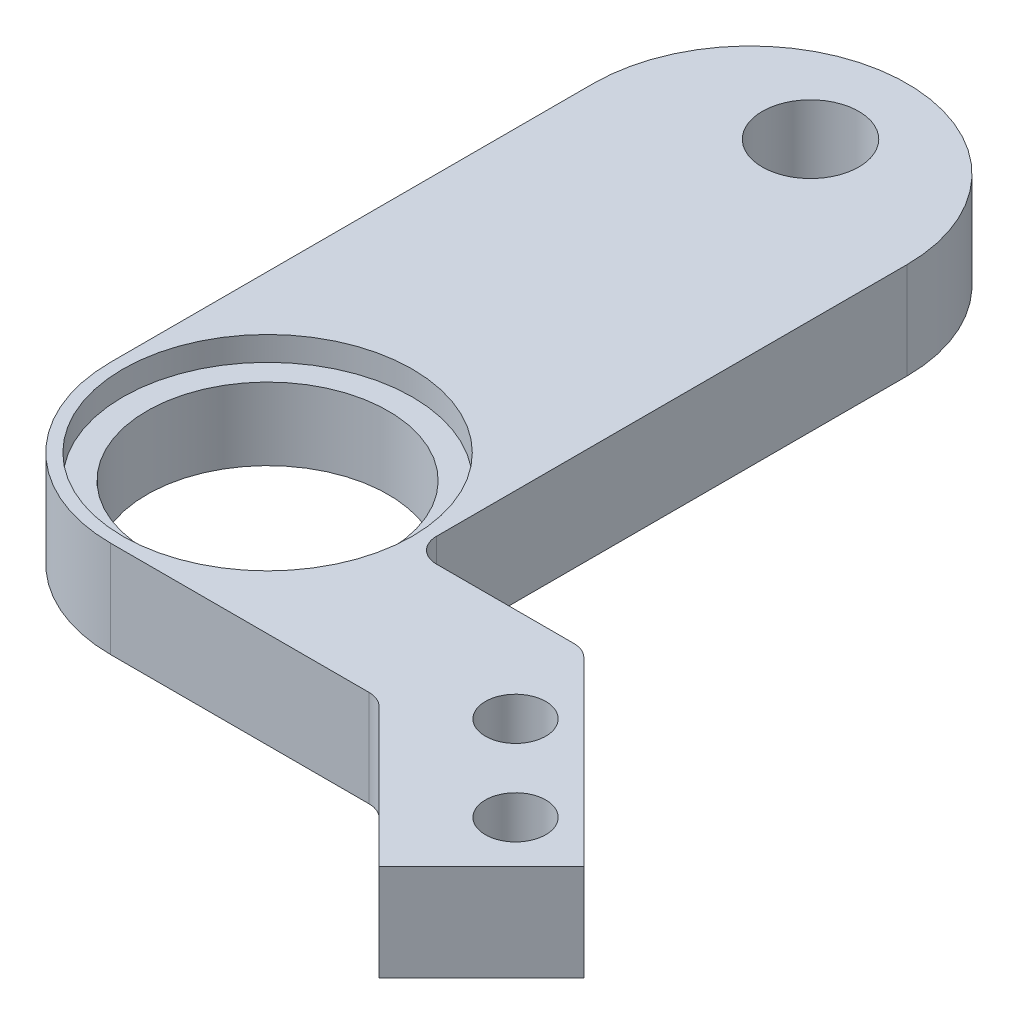
ISO-10303-21;
HEADER;
FILE_DESCRIPTION(('STEP AP214'),'2;1');
FILE_NAME('part.step','',(''),(''),'','','');
FILE_SCHEMA(('AUTOMOTIVE_DESIGN { 1 0 10303 214 1 1 1 1 }'));
ENDSEC;
DATA;
#1=APPLICATION_CONTEXT('core data for automotive mechanical design processes');
#2=APPLICATION_PROTOCOL_DEFINITION('international standard','automotive_design',2000,#1);
#3=PRODUCT_CONTEXT('',#1,'mechanical');
#4=PRODUCT('Part','Part','',(#3));
#5=PRODUCT_RELATED_PRODUCT_CATEGORY('part','',(#4));
#6=PRODUCT_DEFINITION_FORMATION('','',#4);
#7=PRODUCT_DEFINITION_CONTEXT('part definition',#1,'design');
#8=PRODUCT_DEFINITION('design','',#6,#7);
#9=PRODUCT_DEFINITION_SHAPE('','',#8);
#10=(LENGTH_UNIT() NAMED_UNIT(*) SI_UNIT(.MILLI.,.METRE.));
#11=(NAMED_UNIT(*) PLANE_ANGLE_UNIT() SI_UNIT($,.RADIAN.));
#12=(NAMED_UNIT(*) SI_UNIT($,.STERADIAN.) SOLID_ANGLE_UNIT());
#13=UNCERTAINTY_MEASURE_WITH_UNIT(LENGTH_MEASURE(1.E-05),#10,'distance_accuracy_value','');
#14=(GEOMETRIC_REPRESENTATION_CONTEXT(3) GLOBAL_UNCERTAINTY_ASSIGNED_CONTEXT((#13)) GLOBAL_UNIT_ASSIGNED_CONTEXT((#10,
#11,#12)) REPRESENTATION_CONTEXT('',''));
#15=CARTESIAN_POINT('',(0.,0.,0.));
#16=DIRECTION('',(0.,0.,1.));
#17=DIRECTION('',(1.,0.,0.));
#18=AXIS2_PLACEMENT_3D('',#15,#16,#17);
#19=CARTESIAN_POINT('',(2.53296168761796E-09,2.,0.));
#20=DIRECTION('',(0.,-1.,0.));
#21=DIRECTION('',(0.,0.,-1.));
#22=AXIS2_PLACEMENT_3D('',#19,#20,#21);
#23=PLANE('',#22);
#24=DIRECTION('',(0.,0.,-1.));
#25=VECTOR('',#24,1.);
#26=CARTESIAN_POINT('',(-6.5,2.,26.5));
#27=LINE('',#26,#25);
#28=CARTESIAN_POINT('',(-6.5,2.,20.));
#29=VERTEX_POINT('',#28);
#30=CARTESIAN_POINT('',(-6.5,2.,0.));
#31=VERTEX_POINT('',#30);
#32=EDGE_CURVE('E123',#29,#31,#27,.T.);
#33=ORIENTED_EDGE('',*,*,#32,.F.);
#34=CARTESIAN_POINT('',(0.,2.,20.));
#35=DIRECTION('',(0.,-1.,0.));
#36=DIRECTION('',(0.,0.,-1.));
#37=AXIS2_PLACEMENT_3D('',#34,#35,#36);
#38=CIRCLE('',#37,6.5);
#39=CARTESIAN_POINT('',(0.,2.,26.5));
#40=VERTEX_POINT('',#39);
#41=EDGE_CURVE('E11',#29,#40,#38,.F.);
#42=ORIENTED_EDGE('',*,*,#41,.T.);
#43=DIRECTION('',(-1.,0.,0.));
#44=VECTOR('',#43,1.);
#45=CARTESIAN_POINT('',(11.12,2.,26.5));
#46=LINE('',#45,#44);
#47=CARTESIAN_POINT('',(10.7057864376778,2.,26.5));
#48=VERTEX_POINT('',#47);
#49=EDGE_CURVE('E132',#48,#40,#46,.T.);
#50=ORIENTED_EDGE('',*,*,#49,.F.);
#51=CARTESIAN_POINT('',(10.7057864376778,2.,27.5));
#52=DIRECTION('',(0.,-1.,0.));
#53=DIRECTION('',(0.,0.,-1.));
#54=AXIS2_PLACEMENT_3D('',#51,#52,#53);
#55=CIRCLE('',#54,0.999999999999998);
#56=CARTESIAN_POINT('',(11.4128932188029,2.,26.792893218752));
#57=VERTEX_POINT('',#56);
#58=EDGE_CURVE('E213',#48,#57,#55,.T.);
#59=ORIENTED_EDGE('',*,*,#58,.T.);
#60=DIRECTION('',(-0.707106781248037,0.,-0.707106781125058));
#61=VECTOR('',#60,1.);
#62=CARTESIAN_POINT('',(-7.68999999970051,2.,7.69000000357092));
#63=LINE('',#62,#61);
#64=CARTESIAN_POINT('',(17.162942424051,2.,32.542942423));
#65=VERTEX_POINT('',#64);
#66=EDGE_CURVE('E172',#65,#57,#63,.T.);
#67=ORIENTED_EDGE('',*,*,#66,.F.);
#68=DIRECTION('',(-0.707106781186548,0.,0.707106781186547));
#69=VECTOR('',#68,1.);
#70=CARTESIAN_POINT('',(13.6052813740119,2.,36.100603473039));
#71=LINE('',#70,#69);
#72=CARTESIAN_POINT('',(21.405583111051,2.,28.300301736));
#73=VERTEX_POINT('',#72);
#74=EDGE_CURVE('E140',#73,#65,#71,.T.);
#75=ORIENTED_EDGE('',*,*,#74,.F.);
#76=DIRECTION('',(0.707106781233644,0.,0.707106781139451));
#77=VECTOR('',#76,1.);
#78=CARTESIAN_POINT('',(-3.44735931263372,2.,3.44735931562589));
#79=LINE('',#78,#77);
#80=CARTESIAN_POINT('',(13.8981745928173,2.,20.7928932187664));
#81=VERTEX_POINT('',#80);
#82=EDGE_CURVE('E153',#81,#73,#79,.T.);
#83=ORIENTED_EDGE('',*,*,#82,.F.);
#84=CARTESIAN_POINT('',(13.1910678116779,2.,21.5));
#85=DIRECTION('',(0.,-1.,0.));
#86=DIRECTION('',(0.,0.,-1.));
#87=AXIS2_PLACEMENT_3D('',#84,#85,#86);
#88=CIRCLE('',#87,0.999999999999998);
#89=CARTESIAN_POINT('',(13.1910678116779,2.,20.5));
#90=VERTEX_POINT('',#89);
#91=EDGE_CURVE('E205',#81,#90,#88,.F.);
#92=ORIENTED_EDGE('',*,*,#91,.T.);
#93=DIRECTION('',(1.,0.,0.));
#94=VECTOR('',#93,1.);
#95=CARTESIAN_POINT('',(6.50000000506592,2.,20.5));
#96=LINE('',#95,#94);
#97=CARTESIAN_POINT('',(7.50000000506592,2.,20.5));
#98=VERTEX_POINT('',#97);
#99=EDGE_CURVE('E147',#98,#90,#96,.T.);
#100=ORIENTED_EDGE('',*,*,#99,.F.);
#101=CARTESIAN_POINT('',(7.50000000506592,2.,19.5));
#102=DIRECTION('',(0.,-1.,0.));
#103=DIRECTION('',(0.,0.,-1.));
#104=AXIS2_PLACEMENT_3D('',#101,#102,#103);
#105=CIRCLE('',#104,0.999999999999998);
#106=CARTESIAN_POINT('',(6.50000000506592,2.,19.5));
#107=VERTEX_POINT('',#106);
#108=EDGE_CURVE('E209',#98,#107,#105,.T.);
#109=ORIENTED_EDGE('',*,*,#108,.T.);
#110=DIRECTION('',(0.,0.,1.));
#111=VECTOR('',#110,1.);
#112=CARTESIAN_POINT('',(6.50000000506592,2.,0.));
#113=LINE('',#112,#111);
#114=CARTESIAN_POINT('',(6.50000000506592,2.,0.));
#115=VERTEX_POINT('',#114);
#116=EDGE_CURVE('E145',#115,#107,#113,.T.);
#117=ORIENTED_EDGE('',*,*,#116,.F.);
#118=CARTESIAN_POINT('',(2.53296168761796E-09,2.,0.));
#119=DIRECTION('',(0.,-1.,0.));
#120=DIRECTION('',(0.,0.,-1.));
#121=AXIS2_PLACEMENT_3D('',#118,#119,#120);
#122=CIRCLE('',#121,6.50000000253296);
#123=EDGE_CURVE('E131',#31,#115,#122,.T.);
#124=ORIENTED_EDGE('',*,*,#123,.F.);
#125=EDGE_LOOP('',(#33,#42,#50,#59,#67,#75,#83,#92,#100,#109,#117,#124));
#126=FACE_BOUND('',#125,.T.);
#127=CARTESIAN_POINT('',(0.,2.,-2.5));
#128=DIRECTION('',(0.,1.,0.));
#129=DIRECTION('',(0.,0.,1.));
#130=AXIS2_PLACEMENT_3D('',#127,#128,#129);
#131=CIRCLE('',#130,2.);
#132=CARTESIAN_POINT('',(0.,2.,-0.5));
#133=VERTEX_POINT('',#132);
#134=EDGE_CURVE('E267',#133,#133,#131,.T.);
#135=ORIENTED_EDGE('',*,*,#134,.F.);
#136=EDGE_LOOP('',(#135));
#137=FACE_BOUND('',#136,.T.);
#138=CARTESIAN_POINT('',(18.2257623276237,2.,27.9489080793763));
#139=DIRECTION('',(0.,-1.,0.));
#140=DIRECTION('',(0.,0.,-1.));
#141=AXIS2_PLACEMENT_3D('',#138,#139,#140);
#142=CIRCLE('',#141,1.25);
#143=CARTESIAN_POINT('',(18.2257623276237,2.,26.6989080793763));
#144=VERTEX_POINT('',#143);
#145=EDGE_CURVE('E270',#144,#144,#142,.T.);
#146=ORIENTED_EDGE('',*,*,#145,.T.);
#147=EDGE_LOOP('',(#146));
#148=FACE_BOUND('',#147,.T.);
#149=CARTESIAN_POINT('',(14.6902284220255,2.,24.4133741729745));
#150=DIRECTION('',(0.,-1.,0.));
#151=DIRECTION('',(0.,0.,-1.));
#152=AXIS2_PLACEMENT_3D('',#149,#150,#151);
#153=CIRCLE('',#152,1.25);
#154=CARTESIAN_POINT('',(14.6902284220255,2.,23.1633741729745));
#155=VERTEX_POINT('',#154);
#156=EDGE_CURVE('E279',#155,#155,#153,.T.);
#157=ORIENTED_EDGE('',*,*,#156,.T.);
#158=EDGE_LOOP('',(#157));
#159=FACE_BOUND('',#158,.T.);
#160=CARTESIAN_POINT('',(0.,2.,20.));
#161=DIRECTION('',(0.,1.,0.));
#162=DIRECTION('',(0.,0.,1.));
#163=AXIS2_PLACEMENT_3D('',#160,#161,#162);
#164=CIRCLE('',#163,6.00000000000001);
#165=CARTESIAN_POINT('',(0.,2.,26.));
#166=VERTEX_POINT('',#165);
#167=EDGE_CURVE('E297',#166,#166,#164,.T.);
#168=ORIENTED_EDGE('',*,*,#167,.F.);
#169=EDGE_LOOP('',(#168));
#170=FACE_BOUND('',#169,.T.);
#171=ADVANCED_FACE('F32',(#126,#137,#148,#159,#170),#23,.F.);
#172=CARTESIAN_POINT('',(2.53296168761796E-09,-2.,0.));
#173=DIRECTION('',(0.,-1.,0.));
#174=DIRECTION('',(0.,0.,-1.));
#175=AXIS2_PLACEMENT_3D('',#172,#173,#174);
#176=PLANE('',#175);
#177=CARTESIAN_POINT('',(0.,-2.,20.));
#178=DIRECTION('',(0.,1.,0.));
#179=DIRECTION('',(0.,0.,1.));
#180=AXIS2_PLACEMENT_3D('',#177,#178,#179);
#181=CIRCLE('',#180,5.00000000000001);
#182=CARTESIAN_POINT('',(0.,-2.,25.));
#183=VERTEX_POINT('',#182);
#184=EDGE_CURVE('E288',#183,#183,#181,.T.);
#185=ORIENTED_EDGE('',*,*,#184,.T.);
#186=EDGE_LOOP('',(#185));
#187=FACE_BOUND('',#186,.T.);
#188=DIRECTION('',(-1.,0.,0.));
#189=VECTOR('',#188,1.);
#190=CARTESIAN_POINT('',(11.12,-2.,26.5));
#191=LINE('',#190,#189);
#192=CARTESIAN_POINT('',(10.7057864376778,-2.,26.5));
#193=VERTEX_POINT('',#192);
#194=CARTESIAN_POINT('',(0.,-2.,26.5));
#195=VERTEX_POINT('',#194);
#196=EDGE_CURVE('E156',#193,#195,#191,.T.);
#197=ORIENTED_EDGE('',*,*,#196,.T.);
#198=CARTESIAN_POINT('',(0.,-2.,20.));
#199=DIRECTION('',(0.,-1.,0.));
#200=DIRECTION('',(0.,0.,-1.));
#201=AXIS2_PLACEMENT_3D('',#198,#199,#200);
#202=CIRCLE('',#201,6.5);
#203=CARTESIAN_POINT('',(-6.5,-2.,20.));
#204=VERTEX_POINT('',#203);
#205=EDGE_CURVE('E54',#195,#204,#202,.T.);
#206=ORIENTED_EDGE('',*,*,#205,.T.);
#207=DIRECTION('',(0.,0.,-1.));
#208=VECTOR('',#207,1.);
#209=CARTESIAN_POINT('',(-6.5,-2.,26.5));
#210=LINE('',#209,#208);
#211=CARTESIAN_POINT('',(-6.5,-2.,0.));
#212=VERTEX_POINT('',#211);
#213=EDGE_CURVE('E158',#204,#212,#210,.T.);
#214=ORIENTED_EDGE('',*,*,#213,.T.);
#215=CARTESIAN_POINT('',(2.53296168761796E-09,-2.,0.));
#216=DIRECTION('',(0.,-1.,0.));
#217=DIRECTION('',(0.,0.,-1.));
#218=AXIS2_PLACEMENT_3D('',#215,#216,#217);
#219=CIRCLE('',#218,6.50000000253296);
#220=CARTESIAN_POINT('',(6.50000000506592,-2.,0.));
#221=VERTEX_POINT('',#220);
#222=EDGE_CURVE('E138',#212,#221,#219,.T.);
#223=ORIENTED_EDGE('',*,*,#222,.T.);
#224=DIRECTION('',(0.,0.,1.));
#225=VECTOR('',#224,1.);
#226=CARTESIAN_POINT('',(6.50000000506592,-2.,0.));
#227=LINE('',#226,#225);
#228=CARTESIAN_POINT('',(6.50000000506592,-2.,19.5));
#229=VERTEX_POINT('',#228);
#230=EDGE_CURVE('E162',#221,#229,#227,.T.);
#231=ORIENTED_EDGE('',*,*,#230,.T.);
#232=CARTESIAN_POINT('',(7.50000000506592,-2.,19.5));
#233=DIRECTION('',(0.,-1.,0.));
#234=DIRECTION('',(0.,0.,-1.));
#235=AXIS2_PLACEMENT_3D('',#232,#233,#234);
#236=CIRCLE('',#235,0.999999999999998);
#237=CARTESIAN_POINT('',(7.50000000506592,-2.,20.5));
#238=VERTEX_POINT('',#237);
#239=EDGE_CURVE('E207',#229,#238,#236,.F.);
#240=ORIENTED_EDGE('',*,*,#239,.T.);
#241=DIRECTION('',(1.,0.,0.));
#242=VECTOR('',#241,1.);
#243=CARTESIAN_POINT('',(6.50000000506592,-2.,20.5));
#244=LINE('',#243,#242);
#245=CARTESIAN_POINT('',(13.1910678116779,-2.,20.5));
#246=VERTEX_POINT('',#245);
#247=EDGE_CURVE('E165',#238,#246,#244,.T.);
#248=ORIENTED_EDGE('',*,*,#247,.T.);
#249=CARTESIAN_POINT('',(13.1910678116779,-2.,21.5));
#250=DIRECTION('',(0.,-1.,0.));
#251=DIRECTION('',(0.,0.,-1.));
#252=AXIS2_PLACEMENT_3D('',#249,#250,#251);
#253=CIRCLE('',#252,0.999999999999998);
#254=CARTESIAN_POINT('',(13.8981745928173,-2.,20.7928932187664));
#255=VERTEX_POINT('',#254);
#256=EDGE_CURVE('E201',#246,#255,#253,.T.);
#257=ORIENTED_EDGE('',*,*,#256,.T.);
#258=DIRECTION('',(0.707106781233644,0.,0.707106781139451));
#259=VECTOR('',#258,1.);
#260=CARTESIAN_POINT('',(-3.44735931263372,-2.,3.44735931562589));
#261=LINE('',#260,#259);
#262=CARTESIAN_POINT('',(16.1044419845782,-2.,22.9991606102334));
#263=VERTEX_POINT('',#262);
#264=EDGE_CURVE('E173',#255,#263,#261,.T.);
#265=ORIENTED_EDGE('',*,*,#264,.T.);
#266=CARTESIAN_POINT('',(14.6902284220255,-2.,24.4133741729745));
#267=DIRECTION('',(0.,-1.,0.));
#268=DIRECTION('',(0.,0.,-1.));
#269=AXIS2_PLACEMENT_3D('',#266,#267,#268);
#270=CIRCLE('',#269,2.);
#271=EDGE_CURVE('E285',#263,#263,#270,.T.);
#272=ORIENTED_EDGE('',*,*,#271,.F.);
#273=CARTESIAN_POINT('',(19.6399758908137,-2.,26.5346945159979));
#274=VERTEX_POINT('',#273);
#275=EDGE_CURVE('E177',#263,#274,#261,.T.);
#276=ORIENTED_EDGE('',*,*,#275,.T.);
#277=CARTESIAN_POINT('',(18.2257623276237,-2.,27.9489080793763));
#278=DIRECTION('',(0.,-1.,0.));
#279=DIRECTION('',(0.,0.,-1.));
#280=AXIS2_PLACEMENT_3D('',#277,#278,#279);
#281=CIRCLE('',#280,2.);
#282=EDGE_CURVE('E276',#274,#274,#281,.T.);
#283=ORIENTED_EDGE('',*,*,#282,.F.);
#284=CARTESIAN_POINT('',(21.405583111051,-2.,28.300301736));
#285=VERTEX_POINT('',#284);
#286=EDGE_CURVE('E168',#274,#285,#261,.T.);
#287=ORIENTED_EDGE('',*,*,#286,.T.);
#288=DIRECTION('',(-0.707106781186548,0.,0.707106781186547));
#289=VECTOR('',#288,1.);
#290=CARTESIAN_POINT('',(13.6052813740119,-2.,36.100603473039));
#291=LINE('',#290,#289);
#292=CARTESIAN_POINT('',(17.162942424051,-2.,32.542942423));
#293=VERTEX_POINT('',#292);
#294=EDGE_CURVE('E169',#285,#293,#291,.T.);
#295=ORIENTED_EDGE('',*,*,#294,.T.);
#296=DIRECTION('',(-0.707106781248037,0.,-0.707106781125058));
#297=VECTOR('',#296,1.);
#298=CARTESIAN_POINT('',(-7.68999999970051,-2.,7.69000000357092));
#299=LINE('',#298,#297);
#300=CARTESIAN_POINT('',(11.4128932188029,-2.,26.792893218752));
#301=VERTEX_POINT('',#300);
#302=EDGE_CURVE('E159',#293,#301,#299,.T.);
#303=ORIENTED_EDGE('',*,*,#302,.T.);
#304=CARTESIAN_POINT('',(10.7057864376778,-2.,27.5));
#305=DIRECTION('',(0.,-1.,0.));
#306=DIRECTION('',(0.,0.,-1.));
#307=AXIS2_PLACEMENT_3D('',#304,#305,#306);
#308=CIRCLE('',#307,0.999999999999998);
#309=EDGE_CURVE('E211',#301,#193,#308,.F.);
#310=ORIENTED_EDGE('',*,*,#309,.T.);
#311=EDGE_LOOP('',(#197,#206,#214,#223,#231,#240,#248,#257,#265,#272,#276,#283,#287,#295,#303,#310));
#312=FACE_BOUND('',#311,.T.);
#313=CARTESIAN_POINT('',(0.,-2.,-2.5));
#314=DIRECTION('',(0.,1.,0.));
#315=DIRECTION('',(0.,0.,1.));
#316=AXIS2_PLACEMENT_3D('',#313,#314,#315);
#317=CIRCLE('',#316,2.);
#318=CARTESIAN_POINT('',(0.,-2.,-0.500000000000001));
#319=VERTEX_POINT('',#318);
#320=EDGE_CURVE('E184',#319,#319,#317,.T.);
#321=ORIENTED_EDGE('',*,*,#320,.T.);
#322=EDGE_LOOP('',(#321));
#323=FACE_BOUND('',#322,.T.);
#324=ADVANCED_FACE('F226',(#187,#312,#323),#176,.T.);
#325=CARTESIAN_POINT('',(11.12,2.,26.5));
#326=DIRECTION('',(-0.707106781125058,0.,0.707106781248037));
#327=DIRECTION('',(0.707106781248037,0.,0.707106781125058));
#328=AXIS2_PLACEMENT_3D('',#325,#326,#327);
#329=PLANE('',#328);
#330=ORIENTED_EDGE('',*,*,#66,.T.);
#331=DIRECTION('',(0.,-1.,0.));
#332=VECTOR('',#331,1.);
#333=CARTESIAN_POINT('',(11.4128932188029,-2.,26.792893218752));
#334=LINE('',#333,#332);
#335=EDGE_CURVE('E196',#57,#301,#334,.T.);
#336=ORIENTED_EDGE('',*,*,#335,.T.);
#337=ORIENTED_EDGE('',*,*,#302,.F.);
#338=DIRECTION('',(0.,-1.,0.));
#339=VECTOR('',#338,1.);
#340=CARTESIAN_POINT('',(17.162942424051,2.,32.542942423));
#341=LINE('',#340,#339);
#342=EDGE_CURVE('E180',#65,#293,#341,.T.);
#343=ORIENTED_EDGE('',*,*,#342,.F.);
#344=EDGE_LOOP('',(#330,#336,#337,#343));
#345=FACE_BOUND('',#344,.T.);
#346=ADVANCED_FACE('F234',(#345),#329,.T.);
#347=CARTESIAN_POINT('',(13.6052813740119,2.,36.100603473039));
#348=DIRECTION('',(0.707106781186547,0.,0.707106781186548));
#349=DIRECTION('',(0.707106781186548,0.,-0.707106781186547));
#350=AXIS2_PLACEMENT_3D('',#347,#348,#349);
#351=PLANE('',#350);
#352=ORIENTED_EDGE('',*,*,#294,.F.);
#353=DIRECTION('',(0.,-1.,0.));
#354=VECTOR('',#353,1.);
#355=CARTESIAN_POINT('',(21.405583111051,2.,28.300301736));
#356=LINE('',#355,#354);
#357=EDGE_CURVE('E174',#73,#285,#356,.T.);
#358=ORIENTED_EDGE('',*,*,#357,.F.);
#359=ORIENTED_EDGE('',*,*,#74,.T.);
#360=ORIENTED_EDGE('',*,*,#342,.T.);
#361=EDGE_LOOP('',(#352,#358,#359,#360));
#362=FACE_BOUND('',#361,.T.);
#363=ADVANCED_FACE('F241',(#362),#351,.T.);
#364=CARTESIAN_POINT('',(13.6052813740119,2.,20.5));
#365=DIRECTION('',(0.707106781139451,0.,-0.707106781233644));
#366=DIRECTION('',(-0.707106781233644,0.,-0.707106781139451));
#367=AXIS2_PLACEMENT_3D('',#364,#365,#366);
#368=PLANE('',#367);
#369=ORIENTED_EDGE('',*,*,#264,.F.);
#370=DIRECTION('',(0.,-1.,0.));
#371=VECTOR('',#370,1.);
#372=CARTESIAN_POINT('',(13.8981745928173,2.,20.7928932187664));
#373=LINE('',#372,#371);
#374=EDGE_CURVE('E203',#255,#81,#373,.F.);
#375=ORIENTED_EDGE('',*,*,#374,.T.);
#376=ORIENTED_EDGE('',*,*,#82,.T.);
#377=ORIENTED_EDGE('',*,*,#357,.T.);
#378=ORIENTED_EDGE('',*,*,#286,.F.);
#379=ORIENTED_EDGE('',*,*,#275,.F.);
#380=EDGE_LOOP('',(#369,#375,#376,#377,#378,#379));
#381=FACE_BOUND('',#380,.T.);
#382=ADVANCED_FACE('F245',(#381),#368,.T.);
#383=CARTESIAN_POINT('',(6.50000000506592,2.,20.5));
#384=DIRECTION('',(0.,0.,-1.));
#385=DIRECTION('',(-1.,0.,0.));
#386=AXIS2_PLACEMENT_3D('',#383,#384,#385);
#387=PLANE('',#386);
#388=ORIENTED_EDGE('',*,*,#247,.F.);
#389=DIRECTION('',(0.,-1.,0.));
#390=VECTOR('',#389,1.);
#391=CARTESIAN_POINT('',(7.50000000506592,2.,20.5));
#392=LINE('',#391,#390);
#393=EDGE_CURVE('E194',#238,#98,#392,.F.);
#394=ORIENTED_EDGE('',*,*,#393,.T.);
#395=ORIENTED_EDGE('',*,*,#99,.T.);
#396=DIRECTION('',(0.,-1.,0.));
#397=VECTOR('',#396,1.);
#398=CARTESIAN_POINT('',(13.1910678116779,2.,20.5));
#399=LINE('',#398,#397);
#400=EDGE_CURVE('E191',#90,#246,#399,.T.);
#401=ORIENTED_EDGE('',*,*,#400,.T.);
#402=EDGE_LOOP('',(#388,#394,#395,#401));
#403=FACE_BOUND('',#402,.T.);
#404=ADVANCED_FACE('F255',(#403),#387,.T.);
#405=CARTESIAN_POINT('',(6.50000000506592,2.,0.));
#406=DIRECTION('',(1.,0.,0.));
#407=DIRECTION('',(0.,0.,-1.));
#408=AXIS2_PLACEMENT_3D('',#405,#406,#407);
#409=PLANE('',#408);
#410=ORIENTED_EDGE('',*,*,#116,.T.);
#411=DIRECTION('',(0.,-1.,0.));
#412=VECTOR('',#411,1.);
#413=CARTESIAN_POINT('',(6.50000000506592,-2.,19.5));
#414=LINE('',#413,#412);
#415=EDGE_CURVE('E188',#107,#229,#414,.T.);
#416=ORIENTED_EDGE('',*,*,#415,.T.);
#417=ORIENTED_EDGE('',*,*,#230,.F.);
#418=DIRECTION('',(0.,-1.,0.));
#419=VECTOR('',#418,1.);
#420=CARTESIAN_POINT('',(6.50000000506592,2.,0.));
#421=LINE('',#420,#419);
#422=EDGE_CURVE('E139',#115,#221,#421,.T.);
#423=ORIENTED_EDGE('',*,*,#422,.F.);
#424=EDGE_LOOP('',(#410,#416,#417,#423));
#425=FACE_BOUND('',#424,.T.);
#426=ADVANCED_FACE('F263',(#425),#409,.T.);
#427=CARTESIAN_POINT('',(2.53296168761796E-09,2.,0.));
#428=DIRECTION('',(0.,-1.,0.));
#429=DIRECTION('',(0.,0.,-1.));
#430=AXIS2_PLACEMENT_3D('',#427,#428,#429);
#431=CYLINDRICAL_SURFACE('',#430,6.50000000253296);
#432=ORIENTED_EDGE('',*,*,#222,.F.);
#433=DIRECTION('',(0.,-1.,0.));
#434=VECTOR('',#433,1.);
#435=CARTESIAN_POINT('',(-6.5,2.,0.));
#436=LINE('',#435,#434);
#437=EDGE_CURVE('E126',#31,#212,#436,.T.);
#438=ORIENTED_EDGE('',*,*,#437,.F.);
#439=ORIENTED_EDGE('',*,*,#123,.T.);
#440=ORIENTED_EDGE('',*,*,#422,.T.);
#441=EDGE_LOOP('',(#432,#438,#439,#440));
#442=FACE_BOUND('',#441,.T.);
#443=ADVANCED_FACE('F136',(#442),#431,.T.);
#444=CARTESIAN_POINT('',(-6.5,2.,26.5));
#445=DIRECTION('',(-1.,0.,0.));
#446=DIRECTION('',(0.,0.,1.));
#447=AXIS2_PLACEMENT_3D('',#444,#445,#446);
#448=PLANE('',#447);
#449=ORIENTED_EDGE('',*,*,#213,.F.);
#450=DIRECTION('',(0.,-1.,0.));
#451=VECTOR('',#450,1.);
#452=CARTESIAN_POINT('',(-6.5,2.,20.));
#453=LINE('',#452,#451);
#454=EDGE_CURVE('E40',#204,#29,#453,.F.);
#455=ORIENTED_EDGE('',*,*,#454,.T.);
#456=ORIENTED_EDGE('',*,*,#32,.T.);
#457=ORIENTED_EDGE('',*,*,#437,.T.);
#458=EDGE_LOOP('',(#449,#455,#456,#457));
#459=FACE_BOUND('',#458,.T.);
#460=ADVANCED_FACE('F125',(#459),#448,.T.);
#461=CARTESIAN_POINT('',(11.12,2.,26.5));
#462=DIRECTION('',(0.,0.,1.));
#463=DIRECTION('',(1.,0.,0.));
#464=AXIS2_PLACEMENT_3D('',#461,#462,#463);
#465=PLANE('',#464);
#466=ORIENTED_EDGE('',*,*,#49,.T.);
#467=DIRECTION('',(0.,-1.,0.));
#468=VECTOR('',#467,1.);
#469=CARTESIAN_POINT('',(0.,2.,26.5));
#470=LINE('',#469,#468);
#471=EDGE_CURVE('E215',#40,#195,#470,.T.);
#472=ORIENTED_EDGE('',*,*,#471,.T.);
#473=ORIENTED_EDGE('',*,*,#196,.F.);
#474=DIRECTION('',(0.,-1.,0.));
#475=VECTOR('',#474,1.);
#476=CARTESIAN_POINT('',(10.7057864376778,2.,26.5));
#477=LINE('',#476,#475);
#478=EDGE_CURVE('E199',#193,#48,#477,.F.);
#479=ORIENTED_EDGE('',*,*,#478,.T.);
#480=EDGE_LOOP('',(#466,#472,#473,#479));
#481=FACE_BOUND('',#480,.T.);
#482=ADVANCED_FACE('F222',(#481),#465,.T.);
#483=CARTESIAN_POINT('',(0.,2.,-2.5));
#484=DIRECTION('',(0.,1.,0.));
#485=DIRECTION('',(0.,0.,1.));
#486=AXIS2_PLACEMENT_3D('',#483,#484,#485);
#487=CYLINDRICAL_SURFACE('',#486,2.);
#488=ORIENTED_EDGE('',*,*,#320,.F.);
#489=EDGE_LOOP('',(#488));
#490=FACE_BOUND('',#489,.T.);
#491=ORIENTED_EDGE('',*,*,#134,.T.);
#492=EDGE_LOOP('',(#491));
#493=FACE_BOUND('',#492,.T.);
#494=ADVANCED_FACE('F311',(#490,#493),#487,.F.);
#495=CARTESIAN_POINT('',(18.2257623276237,-2.,27.9489080793763));
#496=DIRECTION('',(0.,-1.,0.));
#497=DIRECTION('',(0.,0.,-1.));
#498=AXIS2_PLACEMENT_3D('',#495,#496,#497);
#499=CYLINDRICAL_SURFACE('',#498,1.25);
#500=ORIENTED_EDGE('',*,*,#145,.F.);
#501=EDGE_LOOP('',(#500));
#502=FACE_BOUND('',#501,.T.);
#503=CARTESIAN_POINT('',(18.2257623276237,-1.25,27.9489080793763));
#504=DIRECTION('',(0.,-1.,0.));
#505=DIRECTION('',(0.,0.,-1.));
#506=AXIS2_PLACEMENT_3D('',#503,#504,#505);
#507=CIRCLE('',#506,1.25);
#508=CARTESIAN_POINT('',(18.2257623276237,-1.25,26.6989080793763));
#509=VERTEX_POINT('',#508);
#510=EDGE_CURVE('E273',#509,#509,#507,.T.);
#511=ORIENTED_EDGE('',*,*,#510,.T.);
#512=EDGE_LOOP('',(#511));
#513=FACE_BOUND('',#512,.T.);
#514=ADVANCED_FACE('F363',(#502,#513),#499,.F.);
#515=CARTESIAN_POINT('',(18.2257623276237,-2.,27.9489080793763));
#516=DIRECTION('',(0.,-1.,0.));
#517=DIRECTION('',(0.,0.,-1.));
#518=AXIS2_PLACEMENT_3D('',#515,#516,#517);
#519=CONICAL_SURFACE('',#518,2.,0.785398163397447);
#520=ORIENTED_EDGE('',*,*,#510,.F.);
#521=EDGE_LOOP('',(#520));
#522=FACE_BOUND('',#521,.T.);
#523=ORIENTED_EDGE('',*,*,#282,.T.);
#524=EDGE_LOOP('',(#523));
#525=FACE_BOUND('',#524,.T.);
#526=ADVANCED_FACE('F360',(#522,#525),#519,.F.);
#527=CARTESIAN_POINT('',(14.6902284220255,-2.,24.4133741729745));
#528=DIRECTION('',(0.,-1.,0.));
#529=DIRECTION('',(0.,0.,-1.));
#530=AXIS2_PLACEMENT_3D('',#527,#528,#529);
#531=CYLINDRICAL_SURFACE('',#530,1.25);
#532=ORIENTED_EDGE('',*,*,#156,.F.);
#533=EDGE_LOOP('',(#532));
#534=FACE_BOUND('',#533,.T.);
#535=CARTESIAN_POINT('',(14.6902284220255,-1.25,24.4133741729745));
#536=DIRECTION('',(0.,-1.,0.));
#537=DIRECTION('',(0.,0.,-1.));
#538=AXIS2_PLACEMENT_3D('',#535,#536,#537);
#539=CIRCLE('',#538,1.25);
#540=CARTESIAN_POINT('',(14.6902284220255,-1.25,23.1633741729745));
#541=VERTEX_POINT('',#540);
#542=EDGE_CURVE('E282',#541,#541,#539,.T.);
#543=ORIENTED_EDGE('',*,*,#542,.T.);
#544=EDGE_LOOP('',(#543));
#545=FACE_BOUND('',#544,.T.);
#546=ADVANCED_FACE('F356',(#534,#545),#531,.F.);
#547=CARTESIAN_POINT('',(14.6902284220255,-2.,24.4133741729745));
#548=DIRECTION('',(0.,-1.,0.));
#549=DIRECTION('',(0.,0.,-1.));
#550=AXIS2_PLACEMENT_3D('',#547,#548,#549);
#551=CONICAL_SURFACE('',#550,2.,0.78539816339745);
#552=ORIENTED_EDGE('',*,*,#542,.F.);
#553=EDGE_LOOP('',(#552));
#554=FACE_BOUND('',#553,.T.);
#555=ORIENTED_EDGE('',*,*,#271,.T.);
#556=EDGE_LOOP('',(#555));
#557=FACE_BOUND('',#556,.T.);
#558=ADVANCED_FACE('F332',(#554,#557),#551,.F.);
#559=CARTESIAN_POINT('',(7.50000000506592,2.,19.5));
#560=DIRECTION('',(0.,1.,0.));
#561=DIRECTION('',(0.,0.,1.));
#562=AXIS2_PLACEMENT_3D('',#559,#560,#561);
#563=CYLINDRICAL_SURFACE('',#562,0.999999999999998);
#564=ORIENTED_EDGE('',*,*,#108,.F.);
#565=ORIENTED_EDGE('',*,*,#393,.F.);
#566=ORIENTED_EDGE('',*,*,#239,.F.);
#567=ORIENTED_EDGE('',*,*,#415,.F.);
#568=EDGE_LOOP('',(#564,#565,#566,#567));
#569=FACE_BOUND('',#568,.T.);
#570=ADVANCED_FACE('F261',(#569),#563,.F.);
#571=CARTESIAN_POINT('',(10.7057864376778,2.,27.5));
#572=DIRECTION('',(0.,1.,0.));
#573=DIRECTION('',(0.,0.,1.));
#574=AXIS2_PLACEMENT_3D('',#571,#572,#573);
#575=CYLINDRICAL_SURFACE('',#574,0.999999999999998);
#576=ORIENTED_EDGE('',*,*,#58,.F.);
#577=ORIENTED_EDGE('',*,*,#478,.F.);
#578=ORIENTED_EDGE('',*,*,#309,.F.);
#579=ORIENTED_EDGE('',*,*,#335,.F.);
#580=EDGE_LOOP('',(#576,#577,#578,#579));
#581=FACE_BOUND('',#580,.T.);
#582=ADVANCED_FACE('F232',(#581),#575,.F.);
#583=CARTESIAN_POINT('',(13.1910678116779,2.,21.5));
#584=DIRECTION('',(0.,-1.,0.));
#585=DIRECTION('',(0.,0.,-1.));
#586=AXIS2_PLACEMENT_3D('',#583,#584,#585);
#587=CYLINDRICAL_SURFACE('',#586,0.999999999999998);
#588=ORIENTED_EDGE('',*,*,#91,.F.);
#589=ORIENTED_EDGE('',*,*,#374,.F.);
#590=ORIENTED_EDGE('',*,*,#256,.F.);
#591=ORIENTED_EDGE('',*,*,#400,.F.);
#592=EDGE_LOOP('',(#588,#589,#590,#591));
#593=FACE_BOUND('',#592,.T.);
#594=ADVANCED_FACE('F252',(#593),#587,.T.);
#595=CARTESIAN_POINT('',(0.,2.,20.));
#596=DIRECTION('',(0.,-1.,0.));
#597=DIRECTION('',(0.,0.,-1.));
#598=AXIS2_PLACEMENT_3D('',#595,#596,#597);
#599=CYLINDRICAL_SURFACE('',#598,6.5);
#600=ORIENTED_EDGE('',*,*,#41,.F.);
#601=ORIENTED_EDGE('',*,*,#454,.F.);
#602=ORIENTED_EDGE('',*,*,#205,.F.);
#603=ORIENTED_EDGE('',*,*,#471,.F.);
#604=EDGE_LOOP('',(#600,#601,#602,#603));
#605=FACE_BOUND('',#604,.T.);
#606=ADVANCED_FACE('F34',(#605),#599,.T.);
#607=CARTESIAN_POINT('',(0.,2.,20.));
#608=DIRECTION('',(0.,1.,0.));
#609=DIRECTION('',(0.,0.,1.));
#610=AXIS2_PLACEMENT_3D('',#607,#608,#609);
#611=CYLINDRICAL_SURFACE('',#610,5.00000000000001);
#612=ORIENTED_EDGE('',*,*,#184,.F.);
#613=EDGE_LOOP('',(#612));
#614=FACE_BOUND('',#613,.T.);
#615=CARTESIAN_POINT('',(0.,0.999999999999999,20.));
#616=DIRECTION('',(0.,1.,0.));
#617=DIRECTION('',(0.,0.,1.));
#618=AXIS2_PLACEMENT_3D('',#615,#616,#617);
#619=CIRCLE('',#618,5.00000000000001);
#620=CARTESIAN_POINT('',(0.,0.999999999999999,25.));
#621=VERTEX_POINT('',#620);
#622=EDGE_CURVE('E291',#621,#621,#619,.T.);
#623=ORIENTED_EDGE('',*,*,#622,.T.);
#624=EDGE_LOOP('',(#623));
#625=FACE_BOUND('',#624,.T.);
#626=ADVANCED_FACE('F338',(#614,#625),#611,.F.);
#627=CARTESIAN_POINT('',(5.00000000000001,0.999999999999999,20.));
#628=DIRECTION('',(0.,-1.,0.));
#629=DIRECTION('',(0.,0.,-1.));
#630=AXIS2_PLACEMENT_3D('',#627,#628,#629);
#631=PLANE('',#630);
#632=ORIENTED_EDGE('',*,*,#622,.F.);
#633=EDGE_LOOP('',(#632));
#634=FACE_BOUND('',#633,.T.);
#635=CARTESIAN_POINT('',(0.,0.999999999999999,20.));
#636=DIRECTION('',(0.,1.,0.));
#637=DIRECTION('',(0.,0.,1.));
#638=AXIS2_PLACEMENT_3D('',#635,#636,#637);
#639=CIRCLE('',#638,6.00000000000002);
#640=CARTESIAN_POINT('',(0.,0.999999999999999,26.));
#641=VERTEX_POINT('',#640);
#642=EDGE_CURVE('E294',#641,#641,#639,.T.);
#643=ORIENTED_EDGE('',*,*,#642,.T.);
#644=EDGE_LOOP('',(#643));
#645=FACE_BOUND('',#644,.T.);
#646=ADVANCED_FACE('F342',(#634,#645),#631,.F.);
#647=CARTESIAN_POINT('',(0.,2.,20.));
#648=DIRECTION('',(0.,1.,0.));
#649=DIRECTION('',(0.,0.,1.));
#650=AXIS2_PLACEMENT_3D('',#647,#648,#649);
#651=CYLINDRICAL_SURFACE('',#650,6.00000000000001);
#652=ORIENTED_EDGE('',*,*,#642,.F.);
#653=EDGE_LOOP('',(#652));
#654=FACE_BOUND('',#653,.T.);
#655=ORIENTED_EDGE('',*,*,#167,.T.);
#656=EDGE_LOOP('',(#655));
#657=FACE_BOUND('',#656,.T.);
#658=ADVANCED_FACE('F301',(#654,#657),#651,.F.);
#659=CLOSED_SHELL('',(#171,#324,#346,#363,#382,#404,#426,#443,#460,#482,#494,#514,#526,#546,
#558,#570,#582,#594,#606,#626,#646,#658));
#660=MANIFOLD_SOLID_BREP('B2',#659);
#661=ADVANCED_BREP_SHAPE_REPRESENTATION('',(#18,#660),#14);
#662=SHAPE_DEFINITION_REPRESENTATION(#9,#661);
ENDSEC;
END-ISO-10303-21;
